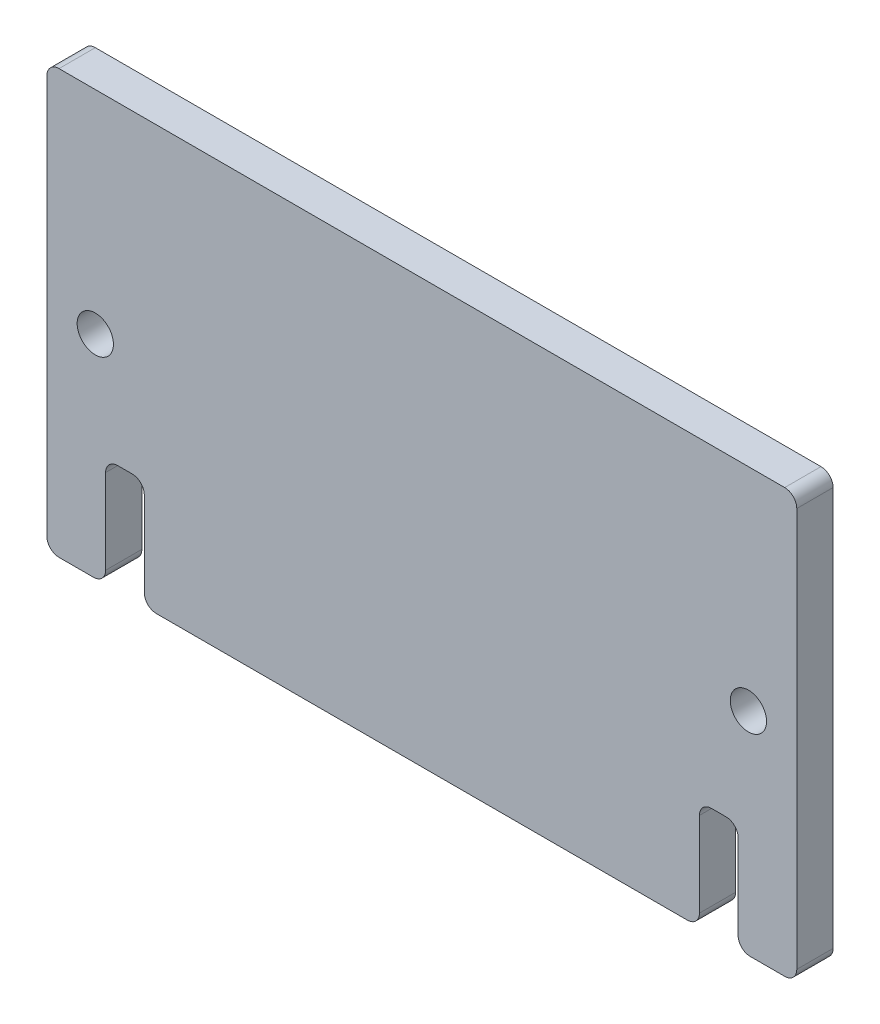
ISO-10303-21;
HEADER;
FILE_DESCRIPTION(('STEP AP214'),'2;1');
FILE_NAME('part.step','',(''),(''),'','','');
FILE_SCHEMA(('AUTOMOTIVE_DESIGN { 1 0 10303 214 1 1 1 1 }'));
ENDSEC;
DATA;
#1=APPLICATION_CONTEXT('core data for automotive mechanical design processes');
#2=APPLICATION_PROTOCOL_DEFINITION('international standard','automotive_design',2000,#1);
#3=PRODUCT_CONTEXT('',#1,'mechanical');
#4=PRODUCT('Part','Part','',(#3));
#5=PRODUCT_RELATED_PRODUCT_CATEGORY('part','',(#4));
#6=PRODUCT_DEFINITION_FORMATION('','',#4);
#7=PRODUCT_DEFINITION_CONTEXT('part definition',#1,'design');
#8=PRODUCT_DEFINITION('design','',#6,#7);
#9=PRODUCT_DEFINITION_SHAPE('','',#8);
#10=(LENGTH_UNIT() NAMED_UNIT(*) SI_UNIT(.MILLI.,.METRE.));
#11=(NAMED_UNIT(*) PLANE_ANGLE_UNIT() SI_UNIT($,.RADIAN.));
#12=(NAMED_UNIT(*) SI_UNIT($,.STERADIAN.) SOLID_ANGLE_UNIT());
#13=UNCERTAINTY_MEASURE_WITH_UNIT(LENGTH_MEASURE(1.E-05),#10,'distance_accuracy_value','');
#14=(GEOMETRIC_REPRESENTATION_CONTEXT(3) GLOBAL_UNCERTAINTY_ASSIGNED_CONTEXT((#13)) GLOBAL_UNIT_ASSIGNED_CONTEXT((#10,
#11,#12)) REPRESENTATION_CONTEXT('',''));
#15=CARTESIAN_POINT('',(0.,0.,0.));
#16=DIRECTION('',(0.,0.,1.));
#17=DIRECTION('',(1.,0.,0.));
#18=AXIS2_PLACEMENT_3D('',#15,#16,#17);
#19=CARTESIAN_POINT('',(0.,0.,3.));
#20=DIRECTION('',(0.,0.,-1.));
#21=DIRECTION('',(-1.,0.,0.));
#22=AXIS2_PLACEMENT_3D('',#19,#20,#21);
#23=PLANE('',#22);
#24=DIRECTION('',(0.,1.,0.));
#25=VECTOR('',#24,1.);
#26=CARTESIAN_POINT('',(31.,-17.5,3.));
#27=LINE('',#26,#25);
#28=CARTESIAN_POINT('',(31.,-16.5,3.));
#29=VERTEX_POINT('',#28);
#30=CARTESIAN_POINT('',(31.,16.5,3.));
#31=VERTEX_POINT('',#30);
#32=EDGE_CURVE('E258',#29,#31,#27,.T.);
#33=ORIENTED_EDGE('',*,*,#32,.T.);
#34=CARTESIAN_POINT('',(30.,16.5,3.));
#35=DIRECTION('',(0.,0.,-1.));
#36=DIRECTION('',(-1.,0.,0.));
#37=AXIS2_PLACEMENT_3D('',#34,#35,#36);
#38=CIRCLE('',#37,1.);
#39=CARTESIAN_POINT('',(30.,17.5,3.));
#40=VERTEX_POINT('',#39);
#41=EDGE_CURVE('E289',#31,#40,#38,.F.);
#42=ORIENTED_EDGE('',*,*,#41,.T.);
#43=DIRECTION('',(-1.,0.,0.));
#44=VECTOR('',#43,1.);
#45=CARTESIAN_POINT('',(-31.,17.5,3.));
#46=LINE('',#45,#44);
#47=CARTESIAN_POINT('',(-30.,17.5,3.));
#48=VERTEX_POINT('',#47);
#49=EDGE_CURVE('E216',#40,#48,#46,.T.);
#50=ORIENTED_EDGE('',*,*,#49,.T.);
#51=CARTESIAN_POINT('',(-30.,16.5,3.));
#52=DIRECTION('',(0.,0.,-1.));
#53=DIRECTION('',(-1.,0.,0.));
#54=AXIS2_PLACEMENT_3D('',#51,#52,#53);
#55=CIRCLE('',#54,1.);
#56=CARTESIAN_POINT('',(-31.,16.5,3.));
#57=VERTEX_POINT('',#56);
#58=EDGE_CURVE('E287',#48,#57,#55,.F.);
#59=ORIENTED_EDGE('',*,*,#58,.T.);
#60=DIRECTION('',(0.,-1.,0.));
#61=VECTOR('',#60,1.);
#62=CARTESIAN_POINT('',(-31.,-17.5,3.));
#63=LINE('',#62,#61);
#64=CARTESIAN_POINT('',(-31.,-16.5,3.));
#65=VERTEX_POINT('',#64);
#66=EDGE_CURVE('E550',#57,#65,#63,.T.);
#67=ORIENTED_EDGE('',*,*,#66,.T.);
#68=CARTESIAN_POINT('',(-30.,-16.5,3.));
#69=DIRECTION('',(0.,0.,-1.));
#70=DIRECTION('',(-1.,0.,0.));
#71=AXIS2_PLACEMENT_3D('',#68,#69,#70);
#72=CIRCLE('',#71,1.);
#73=CARTESIAN_POINT('',(-30.,-17.5,3.));
#74=VERTEX_POINT('',#73);
#75=EDGE_CURVE('E285',#65,#74,#72,.F.);
#76=ORIENTED_EDGE('',*,*,#75,.T.);
#77=DIRECTION('',(1.,0.,0.));
#78=VECTOR('',#77,1.);
#79=CARTESIAN_POINT('',(-31.,-17.5,3.));
#80=LINE('',#79,#78);
#81=CARTESIAN_POINT('',(-27.15,-17.5,3.));
#82=VERTEX_POINT('',#81);
#83=EDGE_CURVE('E378',#74,#82,#80,.T.);
#84=ORIENTED_EDGE('',*,*,#83,.T.);
#85=CARTESIAN_POINT('',(-27.15,-16.5,3.));
#86=DIRECTION('',(0.,0.,-1.));
#87=DIRECTION('',(-1.,0.,0.));
#88=AXIS2_PLACEMENT_3D('',#85,#86,#87);
#89=CIRCLE('',#88,1.);
#90=CARTESIAN_POINT('',(-26.15,-16.5,3.));
#91=VERTEX_POINT('',#90);
#92=EDGE_CURVE('E276',#82,#91,#89,.F.);
#93=ORIENTED_EDGE('',*,*,#92,.T.);
#94=DIRECTION('',(0.,1.,0.));
#95=VECTOR('',#94,1.);
#96=CARTESIAN_POINT('',(-26.15,-17.5,3.));
#97=LINE('',#96,#95);
#98=CARTESIAN_POINT('',(-26.15,-9.50000000000002,3.));
#99=VERTEX_POINT('',#98);
#100=EDGE_CURVE('E369',#91,#99,#97,.T.);
#101=ORIENTED_EDGE('',*,*,#100,.T.);
#102=CARTESIAN_POINT('',(-25.15,-9.50000000000002,3.));
#103=DIRECTION('',(0.,0.,-1.));
#104=DIRECTION('',(-1.,0.,0.));
#105=AXIS2_PLACEMENT_3D('',#102,#103,#104);
#106=CIRCLE('',#105,1.);
#107=CARTESIAN_POINT('',(-25.15,-8.50000000000002,3.));
#108=VERTEX_POINT('',#107);
#109=EDGE_CURVE('E11',#99,#108,#106,.T.);
#110=ORIENTED_EDGE('',*,*,#109,.T.);
#111=DIRECTION('',(1.,0.,0.));
#112=VECTOR('',#111,1.);
#113=CARTESIAN_POINT('',(-26.15,-8.50000000000002,3.));
#114=LINE('',#113,#112);
#115=CARTESIAN_POINT('',(-23.95,-8.50000000000002,3.));
#116=VERTEX_POINT('',#115);
#117=EDGE_CURVE('E367',#108,#116,#114,.T.);
#118=ORIENTED_EDGE('',*,*,#117,.T.);
#119=CARTESIAN_POINT('',(-23.95,-9.50000000000002,3.));
#120=DIRECTION('',(0.,0.,-1.));
#121=DIRECTION('',(-1.,0.,0.));
#122=AXIS2_PLACEMENT_3D('',#119,#120,#121);
#123=CIRCLE('',#122,1.);
#124=CARTESIAN_POINT('',(-22.95,-9.50000000000002,3.));
#125=VERTEX_POINT('',#124);
#126=EDGE_CURVE('E350',#116,#125,#123,.T.);
#127=ORIENTED_EDGE('',*,*,#126,.T.);
#128=DIRECTION('',(0.,-1.,0.));
#129=VECTOR('',#128,1.);
#130=CARTESIAN_POINT('',(-22.95,-8.50000000000002,3.));
#131=LINE('',#130,#129);
#132=CARTESIAN_POINT('',(-22.95,-16.5,3.));
#133=VERTEX_POINT('',#132);
#134=EDGE_CURVE('E373',#125,#133,#131,.T.);
#135=ORIENTED_EDGE('',*,*,#134,.T.);
#136=CARTESIAN_POINT('',(-21.95,-16.5,3.));
#137=DIRECTION('',(0.,0.,-1.));
#138=DIRECTION('',(-1.,0.,0.));
#139=AXIS2_PLACEMENT_3D('',#136,#137,#138);
#140=CIRCLE('',#139,1.);
#141=CARTESIAN_POINT('',(-21.95,-17.5,3.));
#142=VERTEX_POINT('',#141);
#143=EDGE_CURVE('E278',#133,#142,#140,.F.);
#144=ORIENTED_EDGE('',*,*,#143,.T.);
#145=DIRECTION('',(1.,0.,0.));
#146=VECTOR('',#145,1.);
#147=CARTESIAN_POINT('',(-22.95,-17.5,3.));
#148=LINE('',#147,#146);
#149=CARTESIAN_POINT('',(21.95,-17.5,3.));
#150=VERTEX_POINT('',#149);
#151=EDGE_CURVE('E376',#142,#150,#148,.T.);
#152=ORIENTED_EDGE('',*,*,#151,.T.);
#153=CARTESIAN_POINT('',(21.95,-16.5,3.));
#154=DIRECTION('',(0.,0.,-1.));
#155=DIRECTION('',(-1.,0.,0.));
#156=AXIS2_PLACEMENT_3D('',#153,#154,#155);
#157=CIRCLE('',#156,1.);
#158=CARTESIAN_POINT('',(22.95,-16.5,3.));
#159=VERTEX_POINT('',#158);
#160=EDGE_CURVE('E281',#150,#159,#157,.F.);
#161=ORIENTED_EDGE('',*,*,#160,.T.);
#162=DIRECTION('',(0.,1.,0.));
#163=VECTOR('',#162,1.);
#164=CARTESIAN_POINT('',(22.95,-8.50000000000002,3.));
#165=LINE('',#164,#163);
#166=CARTESIAN_POINT('',(22.95,-9.50000000000002,3.));
#167=VERTEX_POINT('',#166);
#168=EDGE_CURVE('E384',#159,#167,#165,.T.);
#169=ORIENTED_EDGE('',*,*,#168,.T.);
#170=CARTESIAN_POINT('',(23.95,-9.50000000000002,3.));
#171=DIRECTION('',(0.,0.,-1.));
#172=DIRECTION('',(-1.,0.,0.));
#173=AXIS2_PLACEMENT_3D('',#170,#171,#172);
#174=CIRCLE('',#173,1.);
#175=CARTESIAN_POINT('',(23.95,-8.50000000000002,3.));
#176=VERTEX_POINT('',#175);
#177=EDGE_CURVE('E346',#167,#176,#174,.T.);
#178=ORIENTED_EDGE('',*,*,#177,.T.);
#179=DIRECTION('',(1.,0.,0.));
#180=VECTOR('',#179,1.);
#181=CARTESIAN_POINT('',(26.15,-8.50000000000002,3.));
#182=LINE('',#181,#180);
#183=CARTESIAN_POINT('',(25.15,-8.50000000000002,3.));
#184=VERTEX_POINT('',#183);
#185=EDGE_CURVE('E387',#176,#184,#182,.T.);
#186=ORIENTED_EDGE('',*,*,#185,.T.);
#187=CARTESIAN_POINT('',(25.15,-9.50000000000002,3.));
#188=DIRECTION('',(0.,0.,-1.));
#189=DIRECTION('',(-1.,0.,0.));
#190=AXIS2_PLACEMENT_3D('',#187,#188,#189);
#191=CIRCLE('',#190,1.);
#192=CARTESIAN_POINT('',(26.15,-9.50000000000002,3.));
#193=VERTEX_POINT('',#192);
#194=EDGE_CURVE('E342',#184,#193,#191,.T.);
#195=ORIENTED_EDGE('',*,*,#194,.T.);
#196=DIRECTION('',(0.,-1.,0.));
#197=VECTOR('',#196,1.);
#198=CARTESIAN_POINT('',(26.15,-17.5,3.));
#199=LINE('',#198,#197);
#200=CARTESIAN_POINT('',(26.15,-16.5,3.));
#201=VERTEX_POINT('',#200);
#202=EDGE_CURVE('E390',#193,#201,#199,.T.);
#203=ORIENTED_EDGE('',*,*,#202,.T.);
#204=CARTESIAN_POINT('',(27.15,-16.5,3.));
#205=DIRECTION('',(0.,0.,-1.));
#206=DIRECTION('',(-1.,0.,0.));
#207=AXIS2_PLACEMENT_3D('',#204,#205,#206);
#208=CIRCLE('',#207,1.);
#209=CARTESIAN_POINT('',(27.15,-17.5,3.));
#210=VERTEX_POINT('',#209);
#211=EDGE_CURVE('E56',#201,#210,#208,.F.);
#212=ORIENTED_EDGE('',*,*,#211,.T.);
#213=DIRECTION('',(1.,0.,0.));
#214=VECTOR('',#213,1.);
#215=CARTESIAN_POINT('',(26.15,-17.5,3.));
#216=LINE('',#215,#214);
#217=CARTESIAN_POINT('',(30.,-17.5,3.));
#218=VERTEX_POINT('',#217);
#219=EDGE_CURVE('E259',#210,#218,#216,.T.);
#220=ORIENTED_EDGE('',*,*,#219,.T.);
#221=CARTESIAN_POINT('',(30.,-16.5,3.));
#222=DIRECTION('',(0.,0.,-1.));
#223=DIRECTION('',(-1.,0.,0.));
#224=AXIS2_PLACEMENT_3D('',#221,#222,#223);
#225=CIRCLE('',#224,1.);
#226=EDGE_CURVE('E283',#218,#29,#225,.F.);
#227=ORIENTED_EDGE('',*,*,#226,.T.);
#228=EDGE_LOOP('',(#33,#42,#50,#59,#67,#76,#84,#93,#101,#110,#118,#127,#135,#144,#152,#161,#169,
#178,#186,#195,#203,#212,#220,#227));
#229=FACE_BOUND('',#228,.T.);
#230=CARTESIAN_POINT('',(-27.,0.,3.));
#231=DIRECTION('',(0.,0.,1.));
#232=DIRECTION('',(1.,0.,0.));
#233=AXIS2_PLACEMENT_3D('',#230,#231,#232);
#234=CIRCLE('',#233,1.5);
#235=CARTESIAN_POINT('',(-25.5,0.,3.));
#236=VERTEX_POINT('',#235);
#237=EDGE_CURVE('E229',#236,#236,#234,.T.);
#238=ORIENTED_EDGE('',*,*,#237,.F.);
#239=EDGE_LOOP('',(#238));
#240=FACE_BOUND('',#239,.T.);
#241=CARTESIAN_POINT('',(27.,0.,3.));
#242=DIRECTION('',(0.,0.,1.));
#243=DIRECTION('',(1.,0.,0.));
#244=AXIS2_PLACEMENT_3D('',#241,#242,#243);
#245=CIRCLE('',#244,1.5);
#246=CARTESIAN_POINT('',(28.5,0.,3.));
#247=VERTEX_POINT('',#246);
#248=EDGE_CURVE('E558',#247,#247,#245,.T.);
#249=ORIENTED_EDGE('',*,*,#248,.F.);
#250=EDGE_LOOP('',(#249));
#251=FACE_BOUND('',#250,.T.);
#252=ADVANCED_FACE('F34',(#229,#240,#251),#23,.F.);
#253=CARTESIAN_POINT('',(0.,0.,0.));
#254=DIRECTION('',(0.,0.,-1.));
#255=DIRECTION('',(-1.,0.,0.));
#256=AXIS2_PLACEMENT_3D('',#253,#254,#255);
#257=PLANE('',#256);
#258=CARTESIAN_POINT('',(-27.,0.,0.));
#259=DIRECTION('',(0.,0.,1.));
#260=DIRECTION('',(1.,0.,0.));
#261=AXIS2_PLACEMENT_3D('',#258,#259,#260);
#262=CIRCLE('',#261,1.5);
#263=CARTESIAN_POINT('',(-25.5,0.,0.));
#264=VERTEX_POINT('',#263);
#265=EDGE_CURVE('E555',#264,#264,#262,.T.);
#266=ORIENTED_EDGE('',*,*,#265,.T.);
#267=EDGE_LOOP('',(#266));
#268=FACE_BOUND('',#267,.T.);
#269=DIRECTION('',(-1.,0.,0.));
#270=VECTOR('',#269,1.);
#271=CARTESIAN_POINT('',(-31.,17.5,0.));
#272=LINE('',#271,#270);
#273=CARTESIAN_POINT('',(30.,17.5,0.));
#274=VERTEX_POINT('',#273);
#275=CARTESIAN_POINT('',(-30.,17.5,0.));
#276=VERTEX_POINT('',#275);
#277=EDGE_CURVE('E213',#274,#276,#272,.T.);
#278=ORIENTED_EDGE('',*,*,#277,.F.);
#279=CARTESIAN_POINT('',(30.,16.5,0.));
#280=DIRECTION('',(0.,0.,-1.));
#281=DIRECTION('',(-1.,0.,0.));
#282=AXIS2_PLACEMENT_3D('',#279,#280,#281);
#283=CIRCLE('',#282,1.);
#284=CARTESIAN_POINT('',(31.,16.5,0.));
#285=VERTEX_POINT('',#284);
#286=EDGE_CURVE('E196',#274,#285,#283,.T.);
#287=ORIENTED_EDGE('',*,*,#286,.T.);
#288=DIRECTION('',(0.,1.,0.));
#289=VECTOR('',#288,1.);
#290=CARTESIAN_POINT('',(31.,-17.5,0.));
#291=LINE('',#290,#289);
#292=CARTESIAN_POINT('',(31.,-16.5,0.));
#293=VERTEX_POINT('',#292);
#294=EDGE_CURVE('E224',#293,#285,#291,.T.);
#295=ORIENTED_EDGE('',*,*,#294,.F.);
#296=CARTESIAN_POINT('',(30.,-16.5,0.));
#297=DIRECTION('',(0.,0.,-1.));
#298=DIRECTION('',(-1.,0.,0.));
#299=AXIS2_PLACEMENT_3D('',#296,#297,#298);
#300=CIRCLE('',#299,1.);
#301=CARTESIAN_POINT('',(30.,-17.5,0.));
#302=VERTEX_POINT('',#301);
#303=EDGE_CURVE('E268',#293,#302,#300,.T.);
#304=ORIENTED_EDGE('',*,*,#303,.T.);
#305=DIRECTION('',(1.,0.,0.));
#306=VECTOR('',#305,1.);
#307=CARTESIAN_POINT('',(26.15,-17.5,0.));
#308=LINE('',#307,#306);
#309=CARTESIAN_POINT('',(27.15,-17.5,0.));
#310=VERTEX_POINT('',#309);
#311=EDGE_CURVE('E256',#310,#302,#308,.T.);
#312=ORIENTED_EDGE('',*,*,#311,.F.);
#313=CARTESIAN_POINT('',(27.15,-16.5,0.));
#314=DIRECTION('',(0.,0.,-1.));
#315=DIRECTION('',(-1.,0.,0.));
#316=AXIS2_PLACEMENT_3D('',#313,#314,#315);
#317=CIRCLE('',#316,1.);
#318=CARTESIAN_POINT('',(26.15,-16.5,0.));
#319=VERTEX_POINT('',#318);
#320=EDGE_CURVE('E264',#310,#319,#317,.T.);
#321=ORIENTED_EDGE('',*,*,#320,.T.);
#322=DIRECTION('',(0.,-1.,0.));
#323=VECTOR('',#322,1.);
#324=CARTESIAN_POINT('',(26.15,-17.5,0.));
#325=LINE('',#324,#323);
#326=CARTESIAN_POINT('',(26.15,-9.50000000000002,0.));
#327=VERTEX_POINT('',#326);
#328=EDGE_CURVE('E253',#327,#319,#325,.T.);
#329=ORIENTED_EDGE('',*,*,#328,.F.);
#330=CARTESIAN_POINT('',(25.15,-9.50000000000002,0.));
#331=DIRECTION('',(0.,0.,-1.));
#332=DIRECTION('',(-1.,0.,0.));
#333=AXIS2_PLACEMENT_3D('',#330,#331,#332);
#334=CIRCLE('',#333,1.);
#335=CARTESIAN_POINT('',(25.15,-8.50000000000002,0.));
#336=VERTEX_POINT('',#335);
#337=EDGE_CURVE('E340',#327,#336,#334,.F.);
#338=ORIENTED_EDGE('',*,*,#337,.T.);
#339=DIRECTION('',(1.,0.,0.));
#340=VECTOR('',#339,1.);
#341=CARTESIAN_POINT('',(26.15,-8.50000000000002,0.));
#342=LINE('',#341,#340);
#343=CARTESIAN_POINT('',(23.95,-8.50000000000002,0.));
#344=VERTEX_POINT('',#343);
#345=EDGE_CURVE('E250',#344,#336,#342,.T.);
#346=ORIENTED_EDGE('',*,*,#345,.F.);
#347=CARTESIAN_POINT('',(23.95,-9.50000000000002,0.));
#348=DIRECTION('',(0.,0.,-1.));
#349=DIRECTION('',(-1.,0.,0.));
#350=AXIS2_PLACEMENT_3D('',#347,#348,#349);
#351=CIRCLE('',#350,1.);
#352=CARTESIAN_POINT('',(22.95,-9.50000000000002,0.));
#353=VERTEX_POINT('',#352);
#354=EDGE_CURVE('E344',#344,#353,#351,.F.);
#355=ORIENTED_EDGE('',*,*,#354,.T.);
#356=DIRECTION('',(0.,1.,0.));
#357=VECTOR('',#356,1.);
#358=CARTESIAN_POINT('',(22.95,-8.50000000000002,0.));
#359=LINE('',#358,#357);
#360=CARTESIAN_POINT('',(22.95,-16.5,0.));
#361=VERTEX_POINT('',#360);
#362=EDGE_CURVE('E247',#361,#353,#359,.T.);
#363=ORIENTED_EDGE('',*,*,#362,.F.);
#364=CARTESIAN_POINT('',(21.95,-16.5,0.));
#365=DIRECTION('',(0.,0.,-1.));
#366=DIRECTION('',(-1.,0.,0.));
#367=AXIS2_PLACEMENT_3D('',#364,#365,#366);
#368=CIRCLE('',#367,1.);
#369=CARTESIAN_POINT('',(21.95,-17.5,0.));
#370=VERTEX_POINT('',#369);
#371=EDGE_CURVE('E266',#361,#370,#368,.T.);
#372=ORIENTED_EDGE('',*,*,#371,.T.);
#373=DIRECTION('',(1.,0.,0.));
#374=VECTOR('',#373,1.);
#375=CARTESIAN_POINT('',(-22.95,-17.5,0.));
#376=LINE('',#375,#374);
#377=CARTESIAN_POINT('',(-21.95,-17.5,0.));
#378=VERTEX_POINT('',#377);
#379=EDGE_CURVE('E244',#378,#370,#376,.T.);
#380=ORIENTED_EDGE('',*,*,#379,.F.);
#381=CARTESIAN_POINT('',(-21.95,-16.5,0.));
#382=DIRECTION('',(0.,0.,-1.));
#383=DIRECTION('',(-1.,0.,0.));
#384=AXIS2_PLACEMENT_3D('',#381,#382,#383);
#385=CIRCLE('',#384,1.);
#386=CARTESIAN_POINT('',(-22.95,-16.5,0.));
#387=VERTEX_POINT('',#386);
#388=EDGE_CURVE('E262',#378,#387,#385,.T.);
#389=ORIENTED_EDGE('',*,*,#388,.T.);
#390=DIRECTION('',(0.,-1.,0.));
#391=VECTOR('',#390,1.);
#392=CARTESIAN_POINT('',(-22.95,-8.50000000000002,0.));
#393=LINE('',#392,#391);
#394=CARTESIAN_POINT('',(-22.95,-9.50000000000002,0.));
#395=VERTEX_POINT('',#394);
#396=EDGE_CURVE('E241',#395,#387,#393,.T.);
#397=ORIENTED_EDGE('',*,*,#396,.F.);
#398=CARTESIAN_POINT('',(-23.95,-9.50000000000002,0.));
#399=DIRECTION('',(0.,0.,-1.));
#400=DIRECTION('',(-1.,0.,0.));
#401=AXIS2_PLACEMENT_3D('',#398,#399,#400);
#402=CIRCLE('',#401,1.);
#403=CARTESIAN_POINT('',(-23.95,-8.50000000000002,0.));
#404=VERTEX_POINT('',#403);
#405=EDGE_CURVE('E348',#395,#404,#402,.F.);
#406=ORIENTED_EDGE('',*,*,#405,.T.);
#407=DIRECTION('',(1.,0.,0.));
#408=VECTOR('',#407,1.);
#409=CARTESIAN_POINT('',(-26.15,-8.50000000000002,0.));
#410=LINE('',#409,#408);
#411=CARTESIAN_POINT('',(-25.15,-8.50000000000002,0.));
#412=VERTEX_POINT('',#411);
#413=EDGE_CURVE('E238',#412,#404,#410,.T.);
#414=ORIENTED_EDGE('',*,*,#413,.F.);
#415=CARTESIAN_POINT('',(-25.15,-9.50000000000002,0.));
#416=DIRECTION('',(0.,0.,-1.));
#417=DIRECTION('',(-1.,0.,0.));
#418=AXIS2_PLACEMENT_3D('',#415,#416,#417);
#419=CIRCLE('',#418,1.);
#420=CARTESIAN_POINT('',(-26.15,-9.50000000000002,0.));
#421=VERTEX_POINT('',#420);
#422=EDGE_CURVE('E42',#412,#421,#419,.F.);
#423=ORIENTED_EDGE('',*,*,#422,.T.);
#424=DIRECTION('',(0.,1.,0.));
#425=VECTOR('',#424,1.);
#426=CARTESIAN_POINT('',(-26.15,-17.5,0.));
#427=LINE('',#426,#425);
#428=CARTESIAN_POINT('',(-26.15,-16.5,0.));
#429=VERTEX_POINT('',#428);
#430=EDGE_CURVE('E235',#429,#421,#427,.T.);
#431=ORIENTED_EDGE('',*,*,#430,.F.);
#432=CARTESIAN_POINT('',(-27.15,-16.5,0.));
#433=DIRECTION('',(0.,0.,-1.));
#434=DIRECTION('',(-1.,0.,0.));
#435=AXIS2_PLACEMENT_3D('',#432,#433,#434);
#436=CIRCLE('',#435,1.);
#437=CARTESIAN_POINT('',(-27.15,-17.5,0.));
#438=VERTEX_POINT('',#437);
#439=EDGE_CURVE('E217',#429,#438,#436,.T.);
#440=ORIENTED_EDGE('',*,*,#439,.T.);
#441=DIRECTION('',(1.,0.,0.));
#442=VECTOR('',#441,1.);
#443=CARTESIAN_POINT('',(-31.,-17.5,0.));
#444=LINE('',#443,#442);
#445=CARTESIAN_POINT('',(-30.,-17.5,0.));
#446=VERTEX_POINT('',#445);
#447=EDGE_CURVE('E227',#446,#438,#444,.T.);
#448=ORIENTED_EDGE('',*,*,#447,.F.);
#449=CARTESIAN_POINT('',(-30.,-16.5,0.));
#450=DIRECTION('',(0.,0.,-1.));
#451=DIRECTION('',(-1.,0.,0.));
#452=AXIS2_PLACEMENT_3D('',#449,#450,#451);
#453=CIRCLE('',#452,1.);
#454=CARTESIAN_POINT('',(-31.,-16.5,0.));
#455=VERTEX_POINT('',#454);
#456=EDGE_CURVE('E270',#446,#455,#453,.T.);
#457=ORIENTED_EDGE('',*,*,#456,.T.);
#458=DIRECTION('',(0.,-1.,0.));
#459=VECTOR('',#458,1.);
#460=CARTESIAN_POINT('',(-31.,-17.5,0.));
#461=LINE('',#460,#459);
#462=CARTESIAN_POINT('',(-31.,16.5,0.));
#463=VERTEX_POINT('',#462);
#464=EDGE_CURVE('E223',#463,#455,#461,.T.);
#465=ORIENTED_EDGE('',*,*,#464,.F.);
#466=CARTESIAN_POINT('',(-30.,16.5,0.));
#467=DIRECTION('',(0.,0.,-1.));
#468=DIRECTION('',(-1.,0.,0.));
#469=AXIS2_PLACEMENT_3D('',#466,#467,#468);
#470=CIRCLE('',#469,1.);
#471=EDGE_CURVE('E207',#463,#276,#470,.T.);
#472=ORIENTED_EDGE('',*,*,#471,.T.);
#473=EDGE_LOOP('',(#278,#287,#295,#304,#312,#321,#329,#338,#346,#355,#363,#372,#380,#389,#397,
#406,#414,#423,#431,#440,#448,#457,#465,#472));
#474=FACE_BOUND('',#473,.T.);
#475=CARTESIAN_POINT('',(27.,0.,0.));
#476=DIRECTION('',(0.,0.,1.));
#477=DIRECTION('',(1.,0.,0.));
#478=AXIS2_PLACEMENT_3D('',#475,#476,#477);
#479=CIRCLE('',#478,1.5);
#480=CARTESIAN_POINT('',(28.5,0.,0.));
#481=VERTEX_POINT('',#480);
#482=EDGE_CURVE('E561',#481,#481,#479,.T.);
#483=ORIENTED_EDGE('',*,*,#482,.T.);
#484=EDGE_LOOP('',(#483));
#485=FACE_BOUND('',#484,.T.);
#486=ADVANCED_FACE('F220',(#268,#474,#485),#257,.T.);
#487=CARTESIAN_POINT('',(31.,-17.5,3.));
#488=DIRECTION('',(-1.,0.,0.));
#489=DIRECTION('',(0.,-1.,0.));
#490=AXIS2_PLACEMENT_3D('',#487,#488,#489);
#491=PLANE('',#490);
#492=ORIENTED_EDGE('',*,*,#294,.T.);
#493=DIRECTION('',(0.,0.,-1.));
#494=VECTOR('',#493,1.);
#495=CARTESIAN_POINT('',(31.,16.5,3.));
#496=LINE('',#495,#494);
#497=EDGE_CURVE('E201',#285,#31,#496,.F.);
#498=ORIENTED_EDGE('',*,*,#497,.T.);
#499=ORIENTED_EDGE('',*,*,#32,.F.);
#500=DIRECTION('',(0.,0.,-1.));
#501=VECTOR('',#500,1.);
#502=CARTESIAN_POINT('',(31.,-16.5,3.));
#503=LINE('',#502,#501);
#504=EDGE_CURVE('E206',#29,#293,#503,.T.);
#505=ORIENTED_EDGE('',*,*,#504,.T.);
#506=EDGE_LOOP('',(#492,#498,#499,#505));
#507=FACE_BOUND('',#506,.T.);
#508=ADVANCED_FACE('F398',(#507),#491,.F.);
#509=CARTESIAN_POINT('',(-31.,17.5,3.));
#510=DIRECTION('',(0.,-1.,0.));
#511=DIRECTION('',(1.,0.,0.));
#512=AXIS2_PLACEMENT_3D('',#509,#510,#511);
#513=PLANE('',#512);
#514=ORIENTED_EDGE('',*,*,#49,.F.);
#515=DIRECTION('',(0.,0.,-1.));
#516=VECTOR('',#515,1.);
#517=CARTESIAN_POINT('',(30.,17.5,3.));
#518=LINE('',#517,#516);
#519=EDGE_CURVE('E200',#40,#274,#518,.T.);
#520=ORIENTED_EDGE('',*,*,#519,.T.);
#521=ORIENTED_EDGE('',*,*,#277,.T.);
#522=DIRECTION('',(0.,0.,-1.));
#523=VECTOR('',#522,1.);
#524=CARTESIAN_POINT('',(-30.,17.5,3.));
#525=LINE('',#524,#523);
#526=EDGE_CURVE('E218',#276,#48,#525,.F.);
#527=ORIENTED_EDGE('',*,*,#526,.T.);
#528=EDGE_LOOP('',(#514,#520,#521,#527));
#529=FACE_BOUND('',#528,.T.);
#530=ADVANCED_FACE('F212',(#529),#513,.F.);
#531=CARTESIAN_POINT('',(-31.,-17.5,3.));
#532=DIRECTION('',(1.,0.,0.));
#533=DIRECTION('',(0.,1.,0.));
#534=AXIS2_PLACEMENT_3D('',#531,#532,#533);
#535=PLANE('',#534);
#536=ORIENTED_EDGE('',*,*,#66,.F.);
#537=DIRECTION('',(0.,0.,-1.));
#538=VECTOR('',#537,1.);
#539=CARTESIAN_POINT('',(-31.,16.5,3.));
#540=LINE('',#539,#538);
#541=EDGE_CURVE('E293',#57,#463,#540,.T.);
#542=ORIENTED_EDGE('',*,*,#541,.T.);
#543=ORIENTED_EDGE('',*,*,#464,.T.);
#544=DIRECTION('',(0.,0.,-1.));
#545=VECTOR('',#544,1.);
#546=CARTESIAN_POINT('',(-31.,-16.5,3.));
#547=LINE('',#546,#545);
#548=EDGE_CURVE('E291',#455,#65,#547,.F.);
#549=ORIENTED_EDGE('',*,*,#548,.T.);
#550=EDGE_LOOP('',(#536,#542,#543,#549));
#551=FACE_BOUND('',#550,.T.);
#552=ADVANCED_FACE('F484',(#551),#535,.F.);
#553=CARTESIAN_POINT('',(-31.,-17.5,3.));
#554=DIRECTION('',(0.,1.,0.));
#555=DIRECTION('',(-1.,0.,0.));
#556=AXIS2_PLACEMENT_3D('',#553,#554,#555);
#557=PLANE('',#556);
#558=ORIENTED_EDGE('',*,*,#83,.F.);
#559=DIRECTION('',(0.,0.,-1.));
#560=VECTOR('',#559,1.);
#561=CARTESIAN_POINT('',(-30.,-17.5,3.));
#562=LINE('',#561,#560);
#563=EDGE_CURVE('E298',#74,#446,#562,.T.);
#564=ORIENTED_EDGE('',*,*,#563,.T.);
#565=ORIENTED_EDGE('',*,*,#447,.T.);
#566=DIRECTION('',(0.,0.,-1.));
#567=VECTOR('',#566,1.);
#568=CARTESIAN_POINT('',(-27.15,-17.5,3.));
#569=LINE('',#568,#567);
#570=EDGE_CURVE('E296',#438,#82,#569,.F.);
#571=ORIENTED_EDGE('',*,*,#570,.T.);
#572=EDGE_LOOP('',(#558,#564,#565,#571));
#573=FACE_BOUND('',#572,.T.);
#574=ADVANCED_FACE('F481',(#573),#557,.F.);
#575=CARTESIAN_POINT('',(-26.15,-17.5,3.));
#576=DIRECTION('',(-1.,0.,0.));
#577=DIRECTION('',(0.,0.,1.));
#578=AXIS2_PLACEMENT_3D('',#575,#576,#577);
#579=PLANE('',#578);
#580=ORIENTED_EDGE('',*,*,#430,.T.);
#581=DIRECTION('',(0.,0.,-1.));
#582=VECTOR('',#581,1.);
#583=CARTESIAN_POINT('',(-26.15,-9.50000000000002,3.));
#584=LINE('',#583,#582);
#585=EDGE_CURVE('E338',#421,#99,#584,.F.);
#586=ORIENTED_EDGE('',*,*,#585,.T.);
#587=ORIENTED_EDGE('',*,*,#100,.F.);
#588=DIRECTION('',(0.,0.,-1.));
#589=VECTOR('',#588,1.);
#590=CARTESIAN_POINT('',(-26.15,-16.5,3.));
#591=LINE('',#590,#589);
#592=EDGE_CURVE('E335',#91,#429,#591,.T.);
#593=ORIENTED_EDGE('',*,*,#592,.T.);
#594=EDGE_LOOP('',(#580,#586,#587,#593));
#595=FACE_BOUND('',#594,.T.);
#596=ADVANCED_FACE('F357',(#595),#579,.F.);
#597=CARTESIAN_POINT('',(-26.15,-8.50000000000002,3.));
#598=DIRECTION('',(0.,1.,0.));
#599=DIRECTION('',(0.,0.,1.));
#600=AXIS2_PLACEMENT_3D('',#597,#598,#599);
#601=PLANE('',#600);
#602=ORIENTED_EDGE('',*,*,#413,.T.);
#603=DIRECTION('',(0.,0.,-1.));
#604=VECTOR('',#603,1.);
#605=CARTESIAN_POINT('',(-23.95,-8.50000000000002,3.));
#606=LINE('',#605,#604);
#607=EDGE_CURVE('E333',#404,#116,#606,.F.);
#608=ORIENTED_EDGE('',*,*,#607,.T.);
#609=ORIENTED_EDGE('',*,*,#117,.F.);
#610=DIRECTION('',(0.,0.,-1.));
#611=VECTOR('',#610,1.);
#612=CARTESIAN_POINT('',(-25.15,-8.50000000000002,0.));
#613=LINE('',#612,#611);
#614=EDGE_CURVE('E330',#108,#412,#613,.T.);
#615=ORIENTED_EDGE('',*,*,#614,.T.);
#616=EDGE_LOOP('',(#602,#608,#609,#615));
#617=FACE_BOUND('',#616,.T.);
#618=ADVANCED_FACE('F371',(#617),#601,.F.);
#619=CARTESIAN_POINT('',(-22.95,-8.50000000000002,3.));
#620=DIRECTION('',(1.,0.,0.));
#621=DIRECTION('',(0.,0.,-1.));
#622=AXIS2_PLACEMENT_3D('',#619,#620,#621);
#623=PLANE('',#622);
#624=ORIENTED_EDGE('',*,*,#396,.T.);
#625=DIRECTION('',(0.,0.,-1.));
#626=VECTOR('',#625,1.);
#627=CARTESIAN_POINT('',(-22.95,-16.5,3.));
#628=LINE('',#627,#626);
#629=EDGE_CURVE('E328',#387,#133,#628,.F.);
#630=ORIENTED_EDGE('',*,*,#629,.T.);
#631=ORIENTED_EDGE('',*,*,#134,.F.);
#632=DIRECTION('',(0.,0.,-1.));
#633=VECTOR('',#632,1.);
#634=CARTESIAN_POINT('',(-22.95,-9.50000000000002,0.));
#635=LINE('',#634,#633);
#636=EDGE_CURVE('E325',#125,#395,#635,.T.);
#637=ORIENTED_EDGE('',*,*,#636,.T.);
#638=EDGE_LOOP('',(#624,#630,#631,#637));
#639=FACE_BOUND('',#638,.T.);
#640=ADVANCED_FACE('F442',(#639),#623,.F.);
#641=CARTESIAN_POINT('',(-22.95,-17.5,3.));
#642=DIRECTION('',(0.,1.,0.));
#643=DIRECTION('',(-1.,0.,0.));
#644=AXIS2_PLACEMENT_3D('',#641,#642,#643);
#645=PLANE('',#644);
#646=ORIENTED_EDGE('',*,*,#379,.T.);
#647=DIRECTION('',(0.,0.,-1.));
#648=VECTOR('',#647,1.);
#649=CARTESIAN_POINT('',(21.95,-17.5,3.));
#650=LINE('',#649,#648);
#651=EDGE_CURVE('E323',#370,#150,#650,.F.);
#652=ORIENTED_EDGE('',*,*,#651,.T.);
#653=ORIENTED_EDGE('',*,*,#151,.F.);
#654=DIRECTION('',(0.,0.,-1.));
#655=VECTOR('',#654,1.);
#656=CARTESIAN_POINT('',(-21.95,-17.5,3.));
#657=LINE('',#656,#655);
#658=EDGE_CURVE('E320',#142,#378,#657,.T.);
#659=ORIENTED_EDGE('',*,*,#658,.T.);
#660=EDGE_LOOP('',(#646,#652,#653,#659));
#661=FACE_BOUND('',#660,.T.);
#662=ADVANCED_FACE('F433',(#661),#645,.F.);
#663=CARTESIAN_POINT('',(22.95,-8.50000000000002,3.));
#664=DIRECTION('',(-1.,0.,0.));
#665=DIRECTION('',(0.,-1.,0.));
#666=AXIS2_PLACEMENT_3D('',#663,#664,#665);
#667=PLANE('',#666);
#668=ORIENTED_EDGE('',*,*,#362,.T.);
#669=DIRECTION('',(0.,0.,-1.));
#670=VECTOR('',#669,1.);
#671=CARTESIAN_POINT('',(22.95,-9.50000000000002,3.));
#672=LINE('',#671,#670);
#673=EDGE_CURVE('E318',#353,#167,#672,.F.);
#674=ORIENTED_EDGE('',*,*,#673,.T.);
#675=ORIENTED_EDGE('',*,*,#168,.F.);
#676=DIRECTION('',(0.,0.,-1.));
#677=VECTOR('',#676,1.);
#678=CARTESIAN_POINT('',(22.95,-16.5,3.));
#679=LINE('',#678,#677);
#680=EDGE_CURVE('E315',#159,#361,#679,.T.);
#681=ORIENTED_EDGE('',*,*,#680,.T.);
#682=EDGE_LOOP('',(#668,#674,#675,#681));
#683=FACE_BOUND('',#682,.T.);
#684=ADVANCED_FACE('F424',(#683),#667,.F.);
#685=CARTESIAN_POINT('',(26.15,-8.50000000000002,3.));
#686=DIRECTION('',(0.,1.,0.));
#687=DIRECTION('',(-1.,0.,0.));
#688=AXIS2_PLACEMENT_3D('',#685,#686,#687);
#689=PLANE('',#688);
#690=ORIENTED_EDGE('',*,*,#345,.T.);
#691=DIRECTION('',(0.,0.,-1.));
#692=VECTOR('',#691,1.);
#693=CARTESIAN_POINT('',(25.15,-8.50000000000002,3.));
#694=LINE('',#693,#692);
#695=EDGE_CURVE('E313',#336,#184,#694,.F.);
#696=ORIENTED_EDGE('',*,*,#695,.T.);
#697=ORIENTED_EDGE('',*,*,#185,.F.);
#698=DIRECTION('',(0.,0.,-1.));
#699=VECTOR('',#698,1.);
#700=CARTESIAN_POINT('',(23.95,-8.50000000000002,0.));
#701=LINE('',#700,#699);
#702=EDGE_CURVE('E310',#176,#344,#701,.T.);
#703=ORIENTED_EDGE('',*,*,#702,.T.);
#704=EDGE_LOOP('',(#690,#696,#697,#703));
#705=FACE_BOUND('',#704,.T.);
#706=ADVANCED_FACE('F415',(#705),#689,.F.);
#707=CARTESIAN_POINT('',(26.15,-17.5,3.));
#708=DIRECTION('',(1.,0.,0.));
#709=DIRECTION('',(0.,1.,0.));
#710=AXIS2_PLACEMENT_3D('',#707,#708,#709);
#711=PLANE('',#710);
#712=ORIENTED_EDGE('',*,*,#202,.F.);
#713=DIRECTION('',(0.,0.,-1.));
#714=VECTOR('',#713,1.);
#715=CARTESIAN_POINT('',(26.15,-9.50000000000002,0.));
#716=LINE('',#715,#714);
#717=EDGE_CURVE('E307',#193,#327,#716,.T.);
#718=ORIENTED_EDGE('',*,*,#717,.T.);
#719=ORIENTED_EDGE('',*,*,#328,.T.);
#720=DIRECTION('',(0.,0.,-1.));
#721=VECTOR('',#720,1.);
#722=CARTESIAN_POINT('',(26.15,-16.5,3.));
#723=LINE('',#722,#721);
#724=EDGE_CURVE('E305',#319,#201,#723,.F.);
#725=ORIENTED_EDGE('',*,*,#724,.T.);
#726=EDGE_LOOP('',(#712,#718,#719,#725));
#727=FACE_BOUND('',#726,.T.);
#728=ADVANCED_FACE('F407',(#727),#711,.F.);
#729=CARTESIAN_POINT('',(26.15,-17.5,3.));
#730=DIRECTION('',(0.,1.,0.));
#731=DIRECTION('',(-1.,0.,0.));
#732=AXIS2_PLACEMENT_3D('',#729,#730,#731);
#733=PLANE('',#732);
#734=ORIENTED_EDGE('',*,*,#311,.T.);
#735=DIRECTION('',(0.,0.,-1.));
#736=VECTOR('',#735,1.);
#737=CARTESIAN_POINT('',(30.,-17.5,3.));
#738=LINE('',#737,#736);
#739=EDGE_CURVE('E49',#302,#218,#738,.F.);
#740=ORIENTED_EDGE('',*,*,#739,.T.);
#741=ORIENTED_EDGE('',*,*,#219,.F.);
#742=DIRECTION('',(0.,0.,-1.));
#743=VECTOR('',#742,1.);
#744=CARTESIAN_POINT('',(27.15,-17.5,3.));
#745=LINE('',#744,#743);
#746=EDGE_CURVE('E301',#210,#310,#745,.T.);
#747=ORIENTED_EDGE('',*,*,#746,.T.);
#748=EDGE_LOOP('',(#734,#740,#741,#747));
#749=FACE_BOUND('',#748,.T.);
#750=ADVANCED_FACE('F400',(#749),#733,.F.);
#751=CARTESIAN_POINT('',(-27.,0.,3.));
#752=DIRECTION('',(0.,0.,-1.));
#753=DIRECTION('',(-1.,0.,0.));
#754=AXIS2_PLACEMENT_3D('',#751,#752,#753);
#755=CYLINDRICAL_SURFACE('',#754,1.5);
#756=ORIENTED_EDGE('',*,*,#237,.T.);
#757=EDGE_LOOP('',(#756));
#758=FACE_BOUND('',#757,.T.);
#759=ORIENTED_EDGE('',*,*,#265,.F.);
#760=EDGE_LOOP('',(#759));
#761=FACE_BOUND('',#760,.T.);
#762=ADVANCED_FACE('F462',(#758,#761),#755,.F.);
#763=CARTESIAN_POINT('',(27.,0.,3.));
#764=DIRECTION('',(0.,0.,-1.));
#765=DIRECTION('',(-1.,0.,0.));
#766=AXIS2_PLACEMENT_3D('',#763,#764,#765);
#767=CYLINDRICAL_SURFACE('',#766,1.5);
#768=ORIENTED_EDGE('',*,*,#248,.T.);
#769=EDGE_LOOP('',(#768));
#770=FACE_BOUND('',#769,.T.);
#771=ORIENTED_EDGE('',*,*,#482,.F.);
#772=EDGE_LOOP('',(#771));
#773=FACE_BOUND('',#772,.T.);
#774=ADVANCED_FACE('F496',(#770,#773),#767,.F.);
#775=CARTESIAN_POINT('',(30.,16.5,3.));
#776=DIRECTION('',(0.,0.,-1.));
#777=DIRECTION('',(-1.,0.,0.));
#778=AXIS2_PLACEMENT_3D('',#775,#776,#777);
#779=CYLINDRICAL_SURFACE('',#778,1.);
#780=ORIENTED_EDGE('',*,*,#41,.F.);
#781=ORIENTED_EDGE('',*,*,#497,.F.);
#782=ORIENTED_EDGE('',*,*,#286,.F.);
#783=ORIENTED_EDGE('',*,*,#519,.F.);
#784=EDGE_LOOP('',(#780,#781,#782,#783));
#785=FACE_BOUND('',#784,.T.);
#786=ADVANCED_FACE('F199',(#785),#779,.T.);
#787=CARTESIAN_POINT('',(-30.,16.5,3.));
#788=DIRECTION('',(0.,0.,-1.));
#789=DIRECTION('',(-1.,0.,0.));
#790=AXIS2_PLACEMENT_3D('',#787,#788,#789);
#791=CYLINDRICAL_SURFACE('',#790,1.);
#792=ORIENTED_EDGE('',*,*,#58,.F.);
#793=ORIENTED_EDGE('',*,*,#526,.F.);
#794=ORIENTED_EDGE('',*,*,#471,.F.);
#795=ORIENTED_EDGE('',*,*,#541,.F.);
#796=EDGE_LOOP('',(#792,#793,#794,#795));
#797=FACE_BOUND('',#796,.T.);
#798=ADVANCED_FACE('F495',(#797),#791,.T.);
#799=CARTESIAN_POINT('',(-30.,-16.5,3.));
#800=DIRECTION('',(0.,0.,-1.));
#801=DIRECTION('',(-1.,0.,0.));
#802=AXIS2_PLACEMENT_3D('',#799,#800,#801);
#803=CYLINDRICAL_SURFACE('',#802,1.);
#804=ORIENTED_EDGE('',*,*,#75,.F.);
#805=ORIENTED_EDGE('',*,*,#548,.F.);
#806=ORIENTED_EDGE('',*,*,#456,.F.);
#807=ORIENTED_EDGE('',*,*,#563,.F.);
#808=EDGE_LOOP('',(#804,#805,#806,#807));
#809=FACE_BOUND('',#808,.T.);
#810=ADVANCED_FACE('F499',(#809),#803,.T.);
#811=CARTESIAN_POINT('',(30.,-16.5,3.));
#812=DIRECTION('',(0.,0.,-1.));
#813=DIRECTION('',(-1.,0.,0.));
#814=AXIS2_PLACEMENT_3D('',#811,#812,#813);
#815=CYLINDRICAL_SURFACE('',#814,1.);
#816=ORIENTED_EDGE('',*,*,#226,.F.);
#817=ORIENTED_EDGE('',*,*,#739,.F.);
#818=ORIENTED_EDGE('',*,*,#303,.F.);
#819=ORIENTED_EDGE('',*,*,#504,.F.);
#820=EDGE_LOOP('',(#816,#817,#818,#819));
#821=FACE_BOUND('',#820,.T.);
#822=ADVANCED_FACE('F396',(#821),#815,.T.);
#823=CARTESIAN_POINT('',(25.15,-9.50000000000002,3.));
#824=DIRECTION('',(0.,0.,1.));
#825=DIRECTION('',(1.,0.,0.));
#826=AXIS2_PLACEMENT_3D('',#823,#824,#825);
#827=CYLINDRICAL_SURFACE('',#826,1.);
#828=ORIENTED_EDGE('',*,*,#194,.F.);
#829=ORIENTED_EDGE('',*,*,#695,.F.);
#830=ORIENTED_EDGE('',*,*,#337,.F.);
#831=ORIENTED_EDGE('',*,*,#717,.F.);
#832=EDGE_LOOP('',(#828,#829,#830,#831));
#833=FACE_BOUND('',#832,.T.);
#834=ADVANCED_FACE('F411',(#833),#827,.F.);
#835=CARTESIAN_POINT('',(23.95,-9.50000000000002,3.));
#836=DIRECTION('',(0.,0.,1.));
#837=DIRECTION('',(1.,0.,0.));
#838=AXIS2_PLACEMENT_3D('',#835,#836,#837);
#839=CYLINDRICAL_SURFACE('',#838,1.);
#840=ORIENTED_EDGE('',*,*,#177,.F.);
#841=ORIENTED_EDGE('',*,*,#673,.F.);
#842=ORIENTED_EDGE('',*,*,#354,.F.);
#843=ORIENTED_EDGE('',*,*,#702,.F.);
#844=EDGE_LOOP('',(#840,#841,#842,#843));
#845=FACE_BOUND('',#844,.T.);
#846=ADVANCED_FACE('F420',(#845),#839,.F.);
#847=CARTESIAN_POINT('',(21.95,-16.5,3.));
#848=DIRECTION('',(0.,0.,-1.));
#849=DIRECTION('',(-1.,0.,0.));
#850=AXIS2_PLACEMENT_3D('',#847,#848,#849);
#851=CYLINDRICAL_SURFACE('',#850,1.);
#852=ORIENTED_EDGE('',*,*,#160,.F.);
#853=ORIENTED_EDGE('',*,*,#651,.F.);
#854=ORIENTED_EDGE('',*,*,#371,.F.);
#855=ORIENTED_EDGE('',*,*,#680,.F.);
#856=EDGE_LOOP('',(#852,#853,#854,#855));
#857=FACE_BOUND('',#856,.T.);
#858=ADVANCED_FACE('F429',(#857),#851,.T.);
#859=CARTESIAN_POINT('',(27.15,-16.5,3.));
#860=DIRECTION('',(0.,0.,-1.));
#861=DIRECTION('',(-1.,0.,0.));
#862=AXIS2_PLACEMENT_3D('',#859,#860,#861);
#863=CYLINDRICAL_SURFACE('',#862,1.);
#864=ORIENTED_EDGE('',*,*,#211,.F.);
#865=ORIENTED_EDGE('',*,*,#724,.F.);
#866=ORIENTED_EDGE('',*,*,#320,.F.);
#867=ORIENTED_EDGE('',*,*,#746,.F.);
#868=EDGE_LOOP('',(#864,#865,#866,#867));
#869=FACE_BOUND('',#868,.T.);
#870=ADVANCED_FACE('F402',(#869),#863,.T.);
#871=CARTESIAN_POINT('',(-21.95,-16.5,3.));
#872=DIRECTION('',(0.,0.,-1.));
#873=DIRECTION('',(-1.,0.,0.));
#874=AXIS2_PLACEMENT_3D('',#871,#872,#873);
#875=CYLINDRICAL_SURFACE('',#874,1.);
#876=ORIENTED_EDGE('',*,*,#143,.F.);
#877=ORIENTED_EDGE('',*,*,#629,.F.);
#878=ORIENTED_EDGE('',*,*,#388,.F.);
#879=ORIENTED_EDGE('',*,*,#658,.F.);
#880=EDGE_LOOP('',(#876,#877,#878,#879));
#881=FACE_BOUND('',#880,.T.);
#882=ADVANCED_FACE('F438',(#881),#875,.T.);
#883=CARTESIAN_POINT('',(-23.95,-9.50000000000002,3.));
#884=DIRECTION('',(0.,0.,1.));
#885=DIRECTION('',(1.,0.,0.));
#886=AXIS2_PLACEMENT_3D('',#883,#884,#885);
#887=CYLINDRICAL_SURFACE('',#886,1.);
#888=ORIENTED_EDGE('',*,*,#126,.F.);
#889=ORIENTED_EDGE('',*,*,#607,.F.);
#890=ORIENTED_EDGE('',*,*,#405,.F.);
#891=ORIENTED_EDGE('',*,*,#636,.F.);
#892=EDGE_LOOP('',(#888,#889,#890,#891));
#893=FACE_BOUND('',#892,.T.);
#894=ADVANCED_FACE('F446',(#893),#887,.F.);
#895=CARTESIAN_POINT('',(-25.15,-9.50000000000002,3.));
#896=DIRECTION('',(0.,0.,1.));
#897=DIRECTION('',(1.,0.,0.));
#898=AXIS2_PLACEMENT_3D('',#895,#896,#897);
#899=CYLINDRICAL_SURFACE('',#898,1.);
#900=ORIENTED_EDGE('',*,*,#109,.F.);
#901=ORIENTED_EDGE('',*,*,#585,.F.);
#902=ORIENTED_EDGE('',*,*,#422,.F.);
#903=ORIENTED_EDGE('',*,*,#614,.F.);
#904=EDGE_LOOP('',(#900,#901,#902,#903));
#905=FACE_BOUND('',#904,.T.);
#906=ADVANCED_FACE('F362',(#905),#899,.F.);
#907=CARTESIAN_POINT('',(-27.15,-16.5,3.));
#908=DIRECTION('',(0.,0.,-1.));
#909=DIRECTION('',(-1.,0.,0.));
#910=AXIS2_PLACEMENT_3D('',#907,#908,#909);
#911=CYLINDRICAL_SURFACE('',#910,1.);
#912=ORIENTED_EDGE('',*,*,#92,.F.);
#913=ORIENTED_EDGE('',*,*,#570,.F.);
#914=ORIENTED_EDGE('',*,*,#439,.F.);
#915=ORIENTED_EDGE('',*,*,#592,.F.);
#916=EDGE_LOOP('',(#912,#913,#914,#915));
#917=FACE_BOUND('',#916,.T.);
#918=ADVANCED_FACE('F36',(#917),#911,.T.);
#919=CLOSED_SHELL('',(#252,#486,#508,#530,#552,#574,#596,#618,#640,#662,#684,#706,#728,#750,
#762,#774,#786,#798,#810,#822,#834,#846,#858,#870,#882,#894,#906,#918));
#920=MANIFOLD_SOLID_BREP('B2',#919);
#921=ADVANCED_BREP_SHAPE_REPRESENTATION('',(#18,#920),#14);
#922=SHAPE_DEFINITION_REPRESENTATION(#9,#921);
ENDSEC;
END-ISO-10303-21;
